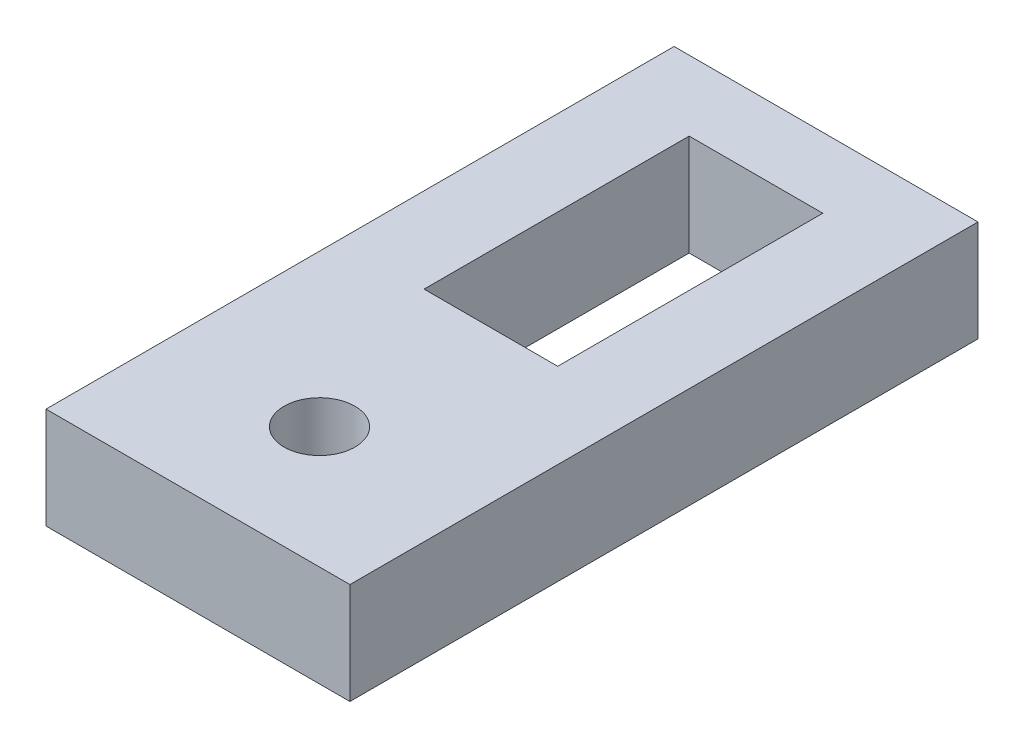
ISO-10303-21;
HEADER;
FILE_DESCRIPTION(('STEP AP214'),'2;1');
FILE_NAME('part.step','',(''),(''),'','','');
FILE_SCHEMA(('AUTOMOTIVE_DESIGN { 1 0 10303 214 1 1 1 1 }'));
ENDSEC;
DATA;
#1=APPLICATION_CONTEXT('core data for automotive mechanical design processes');
#2=APPLICATION_PROTOCOL_DEFINITION('international standard','automotive_design',2000,#1);
#3=PRODUCT_CONTEXT('',#1,'mechanical');
#4=PRODUCT('Part','Part','',(#3));
#5=PRODUCT_RELATED_PRODUCT_CATEGORY('part','',(#4));
#6=PRODUCT_DEFINITION_FORMATION('','',#4);
#7=PRODUCT_DEFINITION_CONTEXT('part definition',#1,'design');
#8=PRODUCT_DEFINITION('design','',#6,#7);
#9=PRODUCT_DEFINITION_SHAPE('','',#8);
#10=(LENGTH_UNIT() NAMED_UNIT(*) SI_UNIT(.MILLI.,.METRE.));
#11=(NAMED_UNIT(*) PLANE_ANGLE_UNIT() SI_UNIT($,.RADIAN.));
#12=(NAMED_UNIT(*) SI_UNIT($,.STERADIAN.) SOLID_ANGLE_UNIT());
#13=UNCERTAINTY_MEASURE_WITH_UNIT(LENGTH_MEASURE(1.E-05),#10,'distance_accuracy_value','');
#14=(GEOMETRIC_REPRESENTATION_CONTEXT(3) GLOBAL_UNCERTAINTY_ASSIGNED_CONTEXT((#13)) GLOBAL_UNIT_ASSIGNED_CONTEXT((#10,
#11,#12)) REPRESENTATION_CONTEXT('',''));
#15=CARTESIAN_POINT('',(0.,0.,0.));
#16=DIRECTION('',(0.,0.,1.));
#17=DIRECTION('',(1.,0.,0.));
#18=AXIS2_PLACEMENT_3D('',#15,#16,#17);
#19=CARTESIAN_POINT('',(15.,-5.,12.));
#20=DIRECTION('',(0.,0.,-1.));
#21=DIRECTION('',(0.,1.,0.));
#22=AXIS2_PLACEMENT_3D('',#19,#20,#21);
#23=PLANE('',#22);
#24=DIRECTION('',(0.,-1.,0.));
#25=VECTOR('',#24,1.);
#26=CARTESIAN_POINT('',(-15.,-5.,12.));
#27=LINE('',#26,#25);
#28=CARTESIAN_POINT('',(-15.,5.,12.));
#29=VERTEX_POINT('',#28);
#30=CARTESIAN_POINT('',(-15.,-5.,12.));
#31=VERTEX_POINT('',#30);
#32=EDGE_CURVE('E145',#29,#31,#27,.T.);
#33=ORIENTED_EDGE('',*,*,#32,.T.);
#34=DIRECTION('',(-1.,0.,0.));
#35=VECTOR('',#34,1.);
#36=CARTESIAN_POINT('',(15.,-5.,12.));
#37=LINE('',#36,#35);
#38=CARTESIAN_POINT('',(15.,-5.,12.));
#39=VERTEX_POINT('',#38);
#40=EDGE_CURVE('E11',#39,#31,#37,.T.);
#41=ORIENTED_EDGE('',*,*,#40,.F.);
#42=DIRECTION('',(0.,-1.,0.));
#43=VECTOR('',#42,1.);
#44=CARTESIAN_POINT('',(15.,-5.,12.));
#45=LINE('',#44,#43);
#46=CARTESIAN_POINT('',(15.,5.,12.));
#47=VERTEX_POINT('',#46);
#48=EDGE_CURVE('E148',#47,#39,#45,.T.);
#49=ORIENTED_EDGE('',*,*,#48,.F.);
#50=DIRECTION('',(-1.,0.,0.));
#51=VECTOR('',#50,1.);
#52=CARTESIAN_POINT('',(15.,5.,12.));
#53=LINE('',#52,#51);
#54=EDGE_CURVE('E158',#47,#29,#53,.T.);
#55=ORIENTED_EDGE('',*,*,#54,.T.);
#56=EDGE_LOOP('',(#33,#41,#49,#55));
#57=FACE_BOUND('',#56,.T.);
#58=ADVANCED_FACE('F35',(#57),#23,.F.);
#59=CARTESIAN_POINT('',(15.,-4.99999999999999,-50.));
#60=DIRECTION('',(0.,1.,0.));
#61=DIRECTION('',(0.,0.,1.));
#62=AXIS2_PLACEMENT_3D('',#59,#60,#61);
#63=PLANE('',#62);
#64=DIRECTION('',(-1.,0.,0.));
#65=VECTOR('',#64,1.);
#66=CARTESIAN_POINT('',(6.59568111211344,-5.,-43.0832363043562));
#67=LINE('',#66,#65);
#68=CARTESIAN_POINT('',(6.59568111211344,-5.,-43.0832363043562));
#69=VERTEX_POINT('',#68);
#70=CARTESIAN_POINT('',(-6.59568111211344,-5.,-43.0832363043562));
#71=VERTEX_POINT('',#70);
#72=EDGE_CURVE('E107',#69,#71,#67,.T.);
#73=ORIENTED_EDGE('',*,*,#72,.T.);
#74=DIRECTION('',(0.,0.,1.));
#75=VECTOR('',#74,1.);
#76=CARTESIAN_POINT('',(-6.59568111211344,-5.,-43.0832363043562));
#77=LINE('',#76,#75);
#78=CARTESIAN_POINT('',(-6.59568111211344,-5.,-16.9167636956438));
#79=VERTEX_POINT('',#78);
#80=EDGE_CURVE('E101',#71,#79,#77,.T.);
#81=ORIENTED_EDGE('',*,*,#80,.T.);
#82=DIRECTION('',(1.,0.,0.));
#83=VECTOR('',#82,1.);
#84=CARTESIAN_POINT('',(6.59568111211344,-5.,-16.9167636956438));
#85=LINE('',#84,#83);
#86=CARTESIAN_POINT('',(6.59568111211344,-4.99999999999999,-16.9167636956438));
#87=VERTEX_POINT('',#86);
#88=EDGE_CURVE('E110',#79,#87,#85,.T.);
#89=ORIENTED_EDGE('',*,*,#88,.T.);
#90=DIRECTION('',(0.,0.,-1.));
#91=VECTOR('',#90,1.);
#92=CARTESIAN_POINT('',(6.59568111211344,-5.,-43.0832363043562));
#93=LINE('',#92,#91);
#94=EDGE_CURVE('E49',#87,#69,#93,.T.);
#95=ORIENTED_EDGE('',*,*,#94,.T.);
#96=EDGE_LOOP('',(#73,#81,#89,#95));
#97=FACE_BOUND('',#96,.T.);
#98=CARTESIAN_POINT('',(0.,-5.,0.));
#99=DIRECTION('',(0.,1.,0.));
#100=DIRECTION('',(0.,0.,1.));
#101=AXIS2_PLACEMENT_3D('',#98,#99,#100);
#102=CIRCLE('',#101,6.5);
#103=CARTESIAN_POINT('',(0.,-5.,6.5));
#104=VERTEX_POINT('',#103);
#105=EDGE_CURVE('E139',#104,#104,#102,.T.);
#106=ORIENTED_EDGE('',*,*,#105,.T.);
#107=EDGE_LOOP('',(#106));
#108=FACE_BOUND('',#107,.T.);
#109=DIRECTION('',(0.,0.,-1.));
#110=VECTOR('',#109,1.);
#111=CARTESIAN_POINT('',(-15.,-4.99999999999999,-50.));
#112=LINE('',#111,#110);
#113=CARTESIAN_POINT('',(-15.,-4.99999999999999,-50.));
#114=VERTEX_POINT('',#113);
#115=EDGE_CURVE('E161',#31,#114,#112,.T.);
#116=ORIENTED_EDGE('',*,*,#115,.T.);
#117=DIRECTION('',(-1.,0.,0.));
#118=VECTOR('',#117,1.);
#119=CARTESIAN_POINT('',(15.,-4.99999999999999,-50.));
#120=LINE('',#119,#118);
#121=CARTESIAN_POINT('',(15.,-4.99999999999999,-50.));
#122=VERTEX_POINT('',#121);
#123=EDGE_CURVE('E42',#122,#114,#120,.T.);
#124=ORIENTED_EDGE('',*,*,#123,.F.);
#125=DIRECTION('',(0.,0.,-1.));
#126=VECTOR('',#125,1.);
#127=CARTESIAN_POINT('',(15.,-4.99999999999999,-50.));
#128=LINE('',#127,#126);
#129=EDGE_CURVE('E151',#39,#122,#128,.T.);
#130=ORIENTED_EDGE('',*,*,#129,.F.);
#131=ORIENTED_EDGE('',*,*,#40,.T.);
#132=EDGE_LOOP('',(#116,#124,#130,#131));
#133=FACE_BOUND('',#132,.T.);
#134=ADVANCED_FACE('F114',(#97,#108,#133),#63,.F.);
#135=CARTESIAN_POINT('',(15.,-4.99999999999999,-50.));
#136=DIRECTION('',(0.,0.,1.));
#137=DIRECTION('',(1.,0.,0.));
#138=AXIS2_PLACEMENT_3D('',#135,#136,#137);
#139=PLANE('',#138);
#140=DIRECTION('',(0.,1.,0.));
#141=VECTOR('',#140,1.);
#142=CARTESIAN_POINT('',(-15.,-4.99999999999999,-50.));
#143=LINE('',#142,#141);
#144=CARTESIAN_POINT('',(-15.,5.00000000000001,-50.));
#145=VERTEX_POINT('',#144);
#146=EDGE_CURVE('E163',#114,#145,#143,.T.);
#147=ORIENTED_EDGE('',*,*,#146,.T.);
#148=DIRECTION('',(-1.,0.,0.));
#149=VECTOR('',#148,1.);
#150=CARTESIAN_POINT('',(15.,5.00000000000001,-50.));
#151=LINE('',#150,#149);
#152=CARTESIAN_POINT('',(15.,5.00000000000001,-50.));
#153=VERTEX_POINT('',#152);
#154=EDGE_CURVE('E168',#153,#145,#151,.T.);
#155=ORIENTED_EDGE('',*,*,#154,.F.);
#156=DIRECTION('',(0.,1.,0.));
#157=VECTOR('',#156,1.);
#158=CARTESIAN_POINT('',(15.,-4.99999999999999,-50.));
#159=LINE('',#158,#157);
#160=EDGE_CURVE('E154',#122,#153,#159,.T.);
#161=ORIENTED_EDGE('',*,*,#160,.F.);
#162=ORIENTED_EDGE('',*,*,#123,.T.);
#163=EDGE_LOOP('',(#147,#155,#161,#162));
#164=FACE_BOUND('',#163,.T.);
#165=ADVANCED_FACE('F175',(#164),#139,.F.);
#166=CARTESIAN_POINT('',(15.,5.00000000000001,-50.));
#167=DIRECTION('',(0.,-1.,0.));
#168=DIRECTION('',(0.,0.,-1.));
#169=AXIS2_PLACEMENT_3D('',#166,#167,#168);
#170=PLANE('',#169);
#171=DIRECTION('',(1.,0.,0.));
#172=VECTOR('',#171,1.);
#173=CARTESIAN_POINT('',(6.59568111211344,5.,-16.9167636956438));
#174=LINE('',#173,#172);
#175=CARTESIAN_POINT('',(-6.59568111211344,5.00000000000001,-16.9167636956438));
#176=VERTEX_POINT('',#175);
#177=CARTESIAN_POINT('',(6.59568111211344,5.,-16.9167636956438));
#178=VERTEX_POINT('',#177);
#179=EDGE_CURVE('E126',#176,#178,#174,.T.);
#180=ORIENTED_EDGE('',*,*,#179,.F.);
#181=DIRECTION('',(0.,0.,1.));
#182=VECTOR('',#181,1.);
#183=CARTESIAN_POINT('',(-6.59568111211344,5.00000000000001,-43.0832363043562));
#184=LINE('',#183,#182);
#185=CARTESIAN_POINT('',(-6.59568111211344,5.00000000000001,-43.0832363043562));
#186=VERTEX_POINT('',#185);
#187=EDGE_CURVE('E57',#186,#176,#184,.T.);
#188=ORIENTED_EDGE('',*,*,#187,.F.);
#189=DIRECTION('',(-1.,0.,0.));
#190=VECTOR('',#189,1.);
#191=CARTESIAN_POINT('',(6.59568111211344,5.00000000000001,-43.0832363043562));
#192=LINE('',#191,#190);
#193=CARTESIAN_POINT('',(6.59568111211344,5.00000000000001,-43.0832363043562));
#194=VERTEX_POINT('',#193);
#195=EDGE_CURVE('E117',#194,#186,#192,.T.);
#196=ORIENTED_EDGE('',*,*,#195,.F.);
#197=DIRECTION('',(0.,0.,-1.));
#198=VECTOR('',#197,1.);
#199=CARTESIAN_POINT('',(6.59568111211344,5.00000000000001,-43.0832363043562));
#200=LINE('',#199,#198);
#201=EDGE_CURVE('E120',#178,#194,#200,.T.);
#202=ORIENTED_EDGE('',*,*,#201,.F.);
#203=EDGE_LOOP('',(#180,#188,#196,#202));
#204=FACE_BOUND('',#203,.T.);
#205=CARTESIAN_POINT('',(0.,5.00000000000001,0.));
#206=DIRECTION('',(0.,-1.,0.));
#207=DIRECTION('',(0.,0.,-1.));
#208=AXIS2_PLACEMENT_3D('',#205,#206,#207);
#209=CIRCLE('',#208,3.5);
#210=CARTESIAN_POINT('',(0.,5.00000000000001,-3.5));
#211=VERTEX_POINT('',#210);
#212=EDGE_CURVE('E136',#211,#211,#209,.T.);
#213=ORIENTED_EDGE('',*,*,#212,.T.);
#214=EDGE_LOOP('',(#213));
#215=FACE_BOUND('',#214,.T.);
#216=DIRECTION('',(0.,0.,1.));
#217=VECTOR('',#216,1.);
#218=CARTESIAN_POINT('',(-15.,5.00000000000001,-50.));
#219=LINE('',#218,#217);
#220=EDGE_CURVE('E152',#145,#29,#219,.T.);
#221=ORIENTED_EDGE('',*,*,#220,.T.);
#222=ORIENTED_EDGE('',*,*,#54,.F.);
#223=DIRECTION('',(0.,0.,1.));
#224=VECTOR('',#223,1.);
#225=CARTESIAN_POINT('',(15.,5.00000000000001,-50.));
#226=LINE('',#225,#224);
#227=EDGE_CURVE('E156',#153,#47,#226,.T.);
#228=ORIENTED_EDGE('',*,*,#227,.F.);
#229=ORIENTED_EDGE('',*,*,#154,.T.);
#230=EDGE_LOOP('',(#221,#222,#228,#229));
#231=FACE_BOUND('',#230,.T.);
#232=ADVANCED_FACE('F184',(#204,#215,#231),#170,.F.);
#233=CARTESIAN_POINT('',(15.,0.,0.));
#234=DIRECTION('',(1.,0.,0.));
#235=DIRECTION('',(0.,0.,-1.));
#236=AXIS2_PLACEMENT_3D('',#233,#234,#235);
#237=PLANE('',#236);
#238=ORIENTED_EDGE('',*,*,#48,.T.);
#239=ORIENTED_EDGE('',*,*,#129,.T.);
#240=ORIENTED_EDGE('',*,*,#160,.T.);
#241=ORIENTED_EDGE('',*,*,#227,.T.);
#242=EDGE_LOOP('',(#238,#239,#240,#241));
#243=FACE_BOUND('',#242,.T.);
#244=ADVANCED_FACE('F190',(#243),#237,.T.);
#245=CARTESIAN_POINT('',(-15.,0.,0.));
#246=DIRECTION('',(1.,0.,0.));
#247=DIRECTION('',(0.,0.,-1.));
#248=AXIS2_PLACEMENT_3D('',#245,#246,#247);
#249=PLANE('',#248);
#250=ORIENTED_EDGE('',*,*,#32,.F.);
#251=ORIENTED_EDGE('',*,*,#220,.F.);
#252=ORIENTED_EDGE('',*,*,#146,.F.);
#253=ORIENTED_EDGE('',*,*,#115,.F.);
#254=EDGE_LOOP('',(#250,#251,#252,#253));
#255=FACE_BOUND('',#254,.T.);
#256=ADVANCED_FACE('F181',(#255),#249,.F.);
#257=CARTESIAN_POINT('',(0.,0.,0.));
#258=DIRECTION('',(0.,-1.,0.));
#259=DIRECTION('',(0.,0.,-1.));
#260=AXIS2_PLACEMENT_3D('',#257,#258,#259);
#261=CYLINDRICAL_SURFACE('',#260,6.5);
#262=CARTESIAN_POINT('',(0.,0.,0.));
#263=DIRECTION('',(0.,1.,0.));
#264=DIRECTION('',(0.,0.,1.));
#265=AXIS2_PLACEMENT_3D('',#262,#263,#264);
#266=CIRCLE('',#265,6.5);
#267=CARTESIAN_POINT('',(0.,0.,6.5));
#268=VERTEX_POINT('',#267);
#269=EDGE_CURVE('E142',#268,#268,#266,.T.);
#270=ORIENTED_EDGE('',*,*,#269,.T.);
#271=EDGE_LOOP('',(#270));
#272=FACE_BOUND('',#271,.T.);
#273=ORIENTED_EDGE('',*,*,#105,.F.);
#274=EDGE_LOOP('',(#273));
#275=FACE_BOUND('',#274,.T.);
#276=ADVANCED_FACE('F203',(#272,#275),#261,.F.);
#277=CARTESIAN_POINT('',(0.,0.,0.));
#278=DIRECTION('',(0.,1.,0.));
#279=DIRECTION('',(0.,0.,1.));
#280=AXIS2_PLACEMENT_3D('',#277,#278,#279);
#281=PLANE('',#280);
#282=CARTESIAN_POINT('',(0.,0.,0.));
#283=DIRECTION('',(0.,-1.,0.));
#284=DIRECTION('',(0.,0.,-1.));
#285=AXIS2_PLACEMENT_3D('',#282,#283,#284);
#286=CIRCLE('',#285,3.5);
#287=CARTESIAN_POINT('',(0.,0.,-3.5));
#288=VERTEX_POINT('',#287);
#289=EDGE_CURVE('E132',#288,#288,#286,.T.);
#290=ORIENTED_EDGE('',*,*,#289,.F.);
#291=EDGE_LOOP('',(#290));
#292=FACE_BOUND('',#291,.T.);
#293=ORIENTED_EDGE('',*,*,#269,.F.);
#294=EDGE_LOOP('',(#293));
#295=FACE_BOUND('',#294,.T.);
#296=ADVANCED_FACE('F208',(#292,#295),#281,.F.);
#297=CARTESIAN_POINT('',(0.,5.00000000000001,0.));
#298=DIRECTION('',(0.,-1.,0.));
#299=DIRECTION('',(0.,0.,-1.));
#300=AXIS2_PLACEMENT_3D('',#297,#298,#299);
#301=CYLINDRICAL_SURFACE('',#300,3.5);
#302=ORIENTED_EDGE('',*,*,#212,.F.);
#303=EDGE_LOOP('',(#302));
#304=FACE_BOUND('',#303,.T.);
#305=ORIENTED_EDGE('',*,*,#289,.T.);
#306=EDGE_LOOP('',(#305));
#307=FACE_BOUND('',#306,.T.);
#308=ADVANCED_FACE('F212',(#304,#307),#301,.F.);
#309=CARTESIAN_POINT('',(-6.59568111211344,-5.,-43.0832363043562));
#310=DIRECTION('',(-1.,0.,0.));
#311=DIRECTION('',(0.,0.,1.));
#312=AXIS2_PLACEMENT_3D('',#309,#310,#311);
#313=PLANE('',#312);
#314=ORIENTED_EDGE('',*,*,#187,.T.);
#315=DIRECTION('',(0.,1.,0.));
#316=VECTOR('',#315,1.);
#317=CARTESIAN_POINT('',(-6.59568111211344,-5.,-16.9167636956438));
#318=LINE('',#317,#316);
#319=EDGE_CURVE('E97',#79,#176,#318,.T.);
#320=ORIENTED_EDGE('',*,*,#319,.F.);
#321=ORIENTED_EDGE('',*,*,#80,.F.);
#322=DIRECTION('',(0.,1.,0.));
#323=VECTOR('',#322,1.);
#324=CARTESIAN_POINT('',(-6.59568111211344,-5.,-43.0832363043562));
#325=LINE('',#324,#323);
#326=EDGE_CURVE('E130',#71,#186,#325,.T.);
#327=ORIENTED_EDGE('',*,*,#326,.T.);
#328=EDGE_LOOP('',(#314,#320,#321,#327));
#329=FACE_BOUND('',#328,.T.);
#330=ADVANCED_FACE('F99',(#329),#313,.F.);
#331=CARTESIAN_POINT('',(6.59568111211344,-5.,-43.0832363043562));
#332=DIRECTION('',(0.,0.,-1.));
#333=DIRECTION('',(0.,1.,0.));
#334=AXIS2_PLACEMENT_3D('',#331,#332,#333);
#335=PLANE('',#334);
#336=ORIENTED_EDGE('',*,*,#195,.T.);
#337=ORIENTED_EDGE('',*,*,#326,.F.);
#338=ORIENTED_EDGE('',*,*,#72,.F.);
#339=DIRECTION('',(0.,1.,0.));
#340=VECTOR('',#339,1.);
#341=CARTESIAN_POINT('',(6.59568111211344,-5.,-43.0832363043562));
#342=LINE('',#341,#340);
#343=EDGE_CURVE('E133',#69,#194,#342,.T.);
#344=ORIENTED_EDGE('',*,*,#343,.T.);
#345=EDGE_LOOP('',(#336,#337,#338,#344));
#346=FACE_BOUND('',#345,.T.);
#347=ADVANCED_FACE('F219',(#346),#335,.F.);
#348=CARTESIAN_POINT('',(6.59568111211344,-5.,-43.0832363043562));
#349=DIRECTION('',(1.,0.,0.));
#350=DIRECTION('',(0.,0.,-1.));
#351=AXIS2_PLACEMENT_3D('',#348,#349,#350);
#352=PLANE('',#351);
#353=ORIENTED_EDGE('',*,*,#201,.T.);
#354=ORIENTED_EDGE('',*,*,#343,.F.);
#355=ORIENTED_EDGE('',*,*,#94,.F.);
#356=DIRECTION('',(0.,1.,0.));
#357=VECTOR('',#356,1.);
#358=CARTESIAN_POINT('',(6.59568111211344,-5.,-16.9167636956438));
#359=LINE('',#358,#357);
#360=EDGE_CURVE('E106',#87,#178,#359,.T.);
#361=ORIENTED_EDGE('',*,*,#360,.T.);
#362=EDGE_LOOP('',(#353,#354,#355,#361));
#363=FACE_BOUND('',#362,.T.);
#364=ADVANCED_FACE('F222',(#363),#352,.F.);
#365=CARTESIAN_POINT('',(6.59568111211344,-5.,-16.9167636956438));
#366=DIRECTION('',(0.,0.,1.));
#367=DIRECTION('',(0.,-1.,0.));
#368=AXIS2_PLACEMENT_3D('',#365,#366,#367);
#369=PLANE('',#368);
#370=ORIENTED_EDGE('',*,*,#179,.T.);
#371=ORIENTED_EDGE('',*,*,#360,.F.);
#372=ORIENTED_EDGE('',*,*,#88,.F.);
#373=ORIENTED_EDGE('',*,*,#319,.T.);
#374=EDGE_LOOP('',(#370,#371,#372,#373));
#375=FACE_BOUND('',#374,.T.);
#376=ADVANCED_FACE('F111',(#375),#369,.F.);
#377=CLOSED_SHELL('',(#58,#134,#165,#232,#244,#256,#276,#296,#308,#330,#347,#364,#376));
#378=MANIFOLD_SOLID_BREP('B2',#377);
#379=ADVANCED_BREP_SHAPE_REPRESENTATION('',(#18,#378),#14);
#380=SHAPE_DEFINITION_REPRESENTATION(#9,#379);
ENDSEC;
END-ISO-10303-21;
